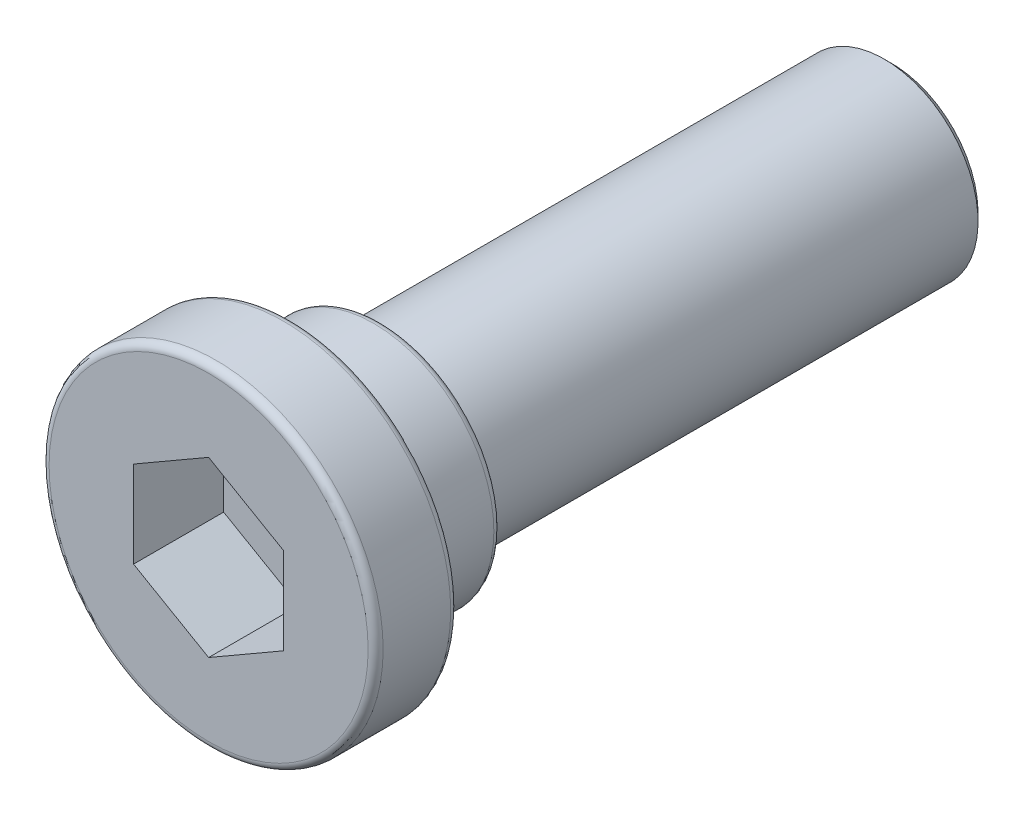
ISO-10303-21;
HEADER;
FILE_DESCRIPTION(('STEP AP214'),'2;1');
FILE_NAME('part.step','',(''),(''),'','','');
FILE_SCHEMA(('AUTOMOTIVE_DESIGN { 1 0 10303 214 1 1 1 1 }'));
ENDSEC;
DATA;
#1=APPLICATION_CONTEXT('core data for automotive mechanical design processes');
#2=APPLICATION_PROTOCOL_DEFINITION('international standard','automotive_design',2000,#1);
#3=PRODUCT_CONTEXT('',#1,'mechanical');
#4=PRODUCT('Part','Part','',(#3));
#5=PRODUCT_RELATED_PRODUCT_CATEGORY('part','',(#4));
#6=PRODUCT_DEFINITION_FORMATION('','',#4);
#7=PRODUCT_DEFINITION_CONTEXT('part definition',#1,'design');
#8=PRODUCT_DEFINITION('design','',#6,#7);
#9=PRODUCT_DEFINITION_SHAPE('','',#8);
#10=(LENGTH_UNIT() NAMED_UNIT(*) SI_UNIT(.MILLI.,.METRE.));
#11=(NAMED_UNIT(*) PLANE_ANGLE_UNIT() SI_UNIT($,.RADIAN.));
#12=(NAMED_UNIT(*) SI_UNIT($,.STERADIAN.) SOLID_ANGLE_UNIT());
#13=UNCERTAINTY_MEASURE_WITH_UNIT(LENGTH_MEASURE(1.E-05),#10,'distance_accuracy_value','');
#14=(GEOMETRIC_REPRESENTATION_CONTEXT(3) GLOBAL_UNCERTAINTY_ASSIGNED_CONTEXT((#13)) GLOBAL_UNIT_ASSIGNED_CONTEXT((#10,
#11,#12)) REPRESENTATION_CONTEXT('',''));
#15=CARTESIAN_POINT('',(0.,0.,0.));
#16=DIRECTION('',(0.,0.,1.));
#17=DIRECTION('',(1.,0.,0.));
#18=AXIS2_PLACEMENT_3D('',#15,#16,#17);
#19=CARTESIAN_POINT('',(0.,0.,7.9));
#20=DIRECTION('',(0.,0.,1.));
#21=DIRECTION('',(1.,0.,0.));
#22=AXIS2_PLACEMENT_3D('',#19,#20,#21);
#23=PLANE('',#22);
#24=DIRECTION('',(0.866025403784439,0.5,0.));
#25=VECTOR('',#24,1.);
#26=CARTESIAN_POINT('',(0.,-1.15470053837925,7.9));
#27=LINE('',#26,#25);
#28=CARTESIAN_POINT('',(0.,-1.15470053837925,7.9));
#29=VERTEX_POINT('',#28);
#30=CARTESIAN_POINT('',(1.,-0.577350269189626,7.9));
#31=VERTEX_POINT('',#30);
#32=EDGE_CURVE('E105',#29,#31,#27,.T.);
#33=ORIENTED_EDGE('',*,*,#32,.T.);
#34=DIRECTION('',(0.,1.,0.));
#35=VECTOR('',#34,1.);
#36=CARTESIAN_POINT('',(1.,-0.577350269189626,7.9));
#37=LINE('',#36,#35);
#38=CARTESIAN_POINT('',(1.,0.577350269189626,7.9));
#39=VERTEX_POINT('',#38);
#40=EDGE_CURVE('E108',#31,#39,#37,.T.);
#41=ORIENTED_EDGE('',*,*,#40,.T.);
#42=DIRECTION('',(-0.866025403784439,0.5,0.));
#43=VECTOR('',#42,1.);
#44=CARTESIAN_POINT('',(1.,0.577350269189626,7.9));
#45=LINE('',#44,#43);
#46=CARTESIAN_POINT('',(0.,1.15470053837925,7.9));
#47=VERTEX_POINT('',#46);
#48=EDGE_CURVE('E110',#39,#47,#45,.T.);
#49=ORIENTED_EDGE('',*,*,#48,.T.);
#50=DIRECTION('',(-0.866025403784439,-0.5,0.));
#51=VECTOR('',#50,1.);
#52=CARTESIAN_POINT('',(0.,1.15470053837925,7.9));
#53=LINE('',#52,#51);
#54=CARTESIAN_POINT('',(-1.,0.577350269189626,7.9));
#55=VERTEX_POINT('',#54);
#56=EDGE_CURVE('E274',#47,#55,#53,.T.);
#57=ORIENTED_EDGE('',*,*,#56,.T.);
#58=DIRECTION('',(0.,-1.,0.));
#59=VECTOR('',#58,1.);
#60=CARTESIAN_POINT('',(-1.,0.577350269189626,7.9));
#61=LINE('',#60,#59);
#62=CARTESIAN_POINT('',(-1.,-0.577350269189626,7.9));
#63=VERTEX_POINT('',#62);
#64=EDGE_CURVE('E281',#55,#63,#61,.T.);
#65=ORIENTED_EDGE('',*,*,#64,.T.);
#66=DIRECTION('',(0.866025403784439,-0.5,0.));
#67=VECTOR('',#66,1.);
#68=CARTESIAN_POINT('',(-1.,-0.577350269189626,7.9));
#69=LINE('',#68,#67);
#70=EDGE_CURVE('E287',#63,#29,#69,.T.);
#71=ORIENTED_EDGE('',*,*,#70,.T.);
#72=EDGE_LOOP('',(#33,#41,#49,#57,#65,#71));
#73=FACE_BOUND('',#72,.T.);
#74=ADVANCED_FACE('F16',(#73),#23,.T.);
#75=CARTESIAN_POINT('',(1.,0.577350269189626,7.9));
#76=DIRECTION('',(0.5,0.866025403784439,0.));
#77=DIRECTION('',(-0.866025403784439,0.5,0.));
#78=AXIS2_PLACEMENT_3D('',#75,#76,#77);
#79=PLANE('',#78);
#80=DIRECTION('',(0.,0.,1.));
#81=VECTOR('',#80,1.);
#82=CARTESIAN_POINT('',(0.,1.15470053837925,7.9));
#83=LINE('',#82,#81);
#84=CARTESIAN_POINT('',(0.,1.15470053837925,9.1));
#85=VERTEX_POINT('',#84);
#86=EDGE_CURVE('E122',#85,#47,#83,.F.);
#87=ORIENTED_EDGE('',*,*,#86,.T.);
#88=ORIENTED_EDGE('',*,*,#48,.F.);
#89=DIRECTION('',(0.,0.,1.));
#90=VECTOR('',#89,1.);
#91=CARTESIAN_POINT('',(1.,0.577350269189626,7.9));
#92=LINE('',#91,#90);
#93=CARTESIAN_POINT('',(1.,0.577350269189626,9.1));
#94=VERTEX_POINT('',#93);
#95=EDGE_CURVE('E116',#39,#94,#92,.T.);
#96=ORIENTED_EDGE('',*,*,#95,.T.);
#97=DIRECTION('',(0.866025403784438,-0.5,0.));
#98=VECTOR('',#97,1.);
#99=CARTESIAN_POINT('',(0.,1.15470053837925,9.1));
#100=LINE('',#99,#98);
#101=EDGE_CURVE('E273',#85,#94,#100,.T.);
#102=ORIENTED_EDGE('',*,*,#101,.F.);
#103=EDGE_LOOP('',(#87,#88,#96,#102));
#104=FACE_BOUND('',#103,.T.);
#105=ADVANCED_FACE('F119',(#104),#79,.F.);
#106=CARTESIAN_POINT('',(1.,-0.577350269189626,7.9));
#107=DIRECTION('',(1.,0.,0.));
#108=DIRECTION('',(0.,1.,0.));
#109=AXIS2_PLACEMENT_3D('',#106,#107,#108);
#110=PLANE('',#109);
#111=ORIENTED_EDGE('',*,*,#95,.F.);
#112=ORIENTED_EDGE('',*,*,#40,.F.);
#113=DIRECTION('',(0.,0.,1.));
#114=VECTOR('',#113,1.);
#115=CARTESIAN_POINT('',(1.,-0.577350269189626,7.9));
#116=LINE('',#115,#114);
#117=CARTESIAN_POINT('',(1.,-0.577350269189626,9.1));
#118=VERTEX_POINT('',#117);
#119=EDGE_CURVE('E136',#31,#118,#116,.T.);
#120=ORIENTED_EDGE('',*,*,#119,.T.);
#121=DIRECTION('',(0.,1.,0.));
#122=VECTOR('',#121,1.);
#123=CARTESIAN_POINT('',(1.,0.,9.1));
#124=LINE('',#123,#122);
#125=EDGE_CURVE('E128',#94,#118,#124,.F.);
#126=ORIENTED_EDGE('',*,*,#125,.F.);
#127=EDGE_LOOP('',(#111,#112,#120,#126));
#128=FACE_BOUND('',#127,.T.);
#129=ADVANCED_FACE('F126',(#128),#110,.F.);
#130=CARTESIAN_POINT('',(0.,-1.15470053837925,7.9));
#131=DIRECTION('',(0.5,-0.866025403784439,0.));
#132=DIRECTION('',(0.866025403784439,0.5,0.));
#133=AXIS2_PLACEMENT_3D('',#130,#131,#132);
#134=PLANE('',#133);
#135=ORIENTED_EDGE('',*,*,#119,.F.);
#136=ORIENTED_EDGE('',*,*,#32,.F.);
#137=DIRECTION('',(0.,0.,1.));
#138=VECTOR('',#137,1.);
#139=CARTESIAN_POINT('',(0.,-1.15470053837925,7.9));
#140=LINE('',#139,#138);
#141=CARTESIAN_POINT('',(0.,-1.15470053837925,9.1));
#142=VERTEX_POINT('',#141);
#143=EDGE_CURVE('E284',#29,#142,#140,.T.);
#144=ORIENTED_EDGE('',*,*,#143,.T.);
#145=DIRECTION('',(-0.866025403784439,-0.5,0.));
#146=VECTOR('',#145,1.);
#147=CARTESIAN_POINT('',(1.,-0.577350269189626,9.1));
#148=LINE('',#147,#146);
#149=EDGE_CURVE('E294',#118,#142,#148,.T.);
#150=ORIENTED_EDGE('',*,*,#149,.F.);
#151=EDGE_LOOP('',(#135,#136,#144,#150));
#152=FACE_BOUND('',#151,.T.);
#153=ADVANCED_FACE('F295',(#152),#134,.F.);
#154=CARTESIAN_POINT('',(-1.,-0.577350269189626,7.9));
#155=DIRECTION('',(-0.5,-0.866025403784439,0.));
#156=DIRECTION('',(0.866025403784439,-0.5,0.));
#157=AXIS2_PLACEMENT_3D('',#154,#155,#156);
#158=PLANE('',#157);
#159=ORIENTED_EDGE('',*,*,#143,.F.);
#160=ORIENTED_EDGE('',*,*,#70,.F.);
#161=DIRECTION('',(0.,0.,1.));
#162=VECTOR('',#161,1.);
#163=CARTESIAN_POINT('',(-1.,-0.577350269189626,7.9));
#164=LINE('',#163,#162);
#165=CARTESIAN_POINT('',(-1.,-0.577350269189626,9.1));
#166=VERTEX_POINT('',#165);
#167=EDGE_CURVE('E278',#63,#166,#164,.T.);
#168=ORIENTED_EDGE('',*,*,#167,.T.);
#169=DIRECTION('',(-0.866025403784439,0.5,0.));
#170=VECTOR('',#169,1.);
#171=CARTESIAN_POINT('',(0.,-1.15470053837925,9.1));
#172=LINE('',#171,#170);
#173=EDGE_CURVE('E301',#142,#166,#172,.T.);
#174=ORIENTED_EDGE('',*,*,#173,.F.);
#175=EDGE_LOOP('',(#159,#160,#168,#174));
#176=FACE_BOUND('',#175,.T.);
#177=ADVANCED_FACE('F397',(#176),#158,.F.);
#178=CARTESIAN_POINT('',(-1.,0.577350269189626,7.9));
#179=DIRECTION('',(-1.,0.,0.));
#180=DIRECTION('',(0.,-1.,0.));
#181=AXIS2_PLACEMENT_3D('',#178,#179,#180);
#182=PLANE('',#181);
#183=ORIENTED_EDGE('',*,*,#167,.F.);
#184=ORIENTED_EDGE('',*,*,#64,.F.);
#185=DIRECTION('',(0.,0.,1.));
#186=VECTOR('',#185,1.);
#187=CARTESIAN_POINT('',(-1.,0.577350269189626,7.9));
#188=LINE('',#187,#186);
#189=CARTESIAN_POINT('',(-1.,0.577350269189626,9.1));
#190=VERTEX_POINT('',#189);
#191=EDGE_CURVE('E265',#55,#190,#188,.T.);
#192=ORIENTED_EDGE('',*,*,#191,.T.);
#193=DIRECTION('',(0.,1.,0.));
#194=VECTOR('',#193,1.);
#195=CARTESIAN_POINT('',(-1.,0.,9.1));
#196=LINE('',#195,#194);
#197=EDGE_CURVE('E311',#166,#190,#196,.T.);
#198=ORIENTED_EDGE('',*,*,#197,.F.);
#199=EDGE_LOOP('',(#183,#184,#192,#198));
#200=FACE_BOUND('',#199,.T.);
#201=ADVANCED_FACE('F352',(#200),#182,.F.);
#202=CARTESIAN_POINT('',(0.,1.15470053837925,7.9));
#203=DIRECTION('',(-0.5,0.866025403784439,0.));
#204=DIRECTION('',(-0.866025403784439,-0.5,0.));
#205=AXIS2_PLACEMENT_3D('',#202,#203,#204);
#206=PLANE('',#205);
#207=ORIENTED_EDGE('',*,*,#191,.F.);
#208=ORIENTED_EDGE('',*,*,#56,.F.);
#209=ORIENTED_EDGE('',*,*,#86,.F.);
#210=DIRECTION('',(0.866025403784438,0.5,0.));
#211=VECTOR('',#210,1.);
#212=CARTESIAN_POINT('',(-1.,0.577350269189626,9.1));
#213=LINE('',#212,#211);
#214=EDGE_CURVE('E314',#190,#85,#213,.T.);
#215=ORIENTED_EDGE('',*,*,#214,.F.);
#216=EDGE_LOOP('',(#207,#208,#209,#215));
#217=FACE_BOUND('',#216,.T.);
#218=ADVANCED_FACE('F347',(#217),#206,.F.);
#219=CARTESIAN_POINT('',(0.,0.,9.1));
#220=DIRECTION('',(0.,0.,1.));
#221=DIRECTION('',(1.,0.,0.));
#222=AXIS2_PLACEMENT_3D('',#219,#220,#221);
#223=PLANE('',#222);
#224=ORIENTED_EDGE('',*,*,#197,.T.);
#225=ORIENTED_EDGE('',*,*,#214,.T.);
#226=ORIENTED_EDGE('',*,*,#101,.T.);
#227=ORIENTED_EDGE('',*,*,#125,.T.);
#228=ORIENTED_EDGE('',*,*,#149,.T.);
#229=ORIENTED_EDGE('',*,*,#173,.T.);
#230=EDGE_LOOP('',(#224,#225,#226,#227,#228,#229));
#231=FACE_BOUND('',#230,.T.);
#232=CARTESIAN_POINT('',(0.,0.,9.1));
#233=DIRECTION('',(0.,0.,-1.));
#234=DIRECTION('',(-1.,0.,0.));
#235=AXIS2_PLACEMENT_3D('',#232,#233,#234);
#236=CIRCLE('',#235,2.125);
#237=CARTESIAN_POINT('',(-2.125,0.,9.1));
#238=VERTEX_POINT('',#237);
#239=CARTESIAN_POINT('',(2.125,0.,9.1));
#240=VERTEX_POINT('',#239);
#241=EDGE_CURVE('E317',#238,#240,#236,.T.);
#242=ORIENTED_EDGE('',*,*,#241,.F.);
#243=CARTESIAN_POINT('',(0.,0.,9.1));
#244=DIRECTION('',(0.,0.,-1.));
#245=DIRECTION('',(1.,0.,0.));
#246=AXIS2_PLACEMENT_3D('',#243,#244,#245);
#247=CIRCLE('',#246,2.125);
#248=EDGE_CURVE('E244',#240,#238,#247,.T.);
#249=ORIENTED_EDGE('',*,*,#248,.F.);
#250=EDGE_LOOP('',(#242,#249));
#251=FACE_BOUND('',#250,.T.);
#252=ADVANCED_FACE('F253',(#231,#251),#223,.T.);
#253=CARTESIAN_POINT('',(0.,0.,9.));
#254=DIRECTION('',(0.,0.,1.));
#255=DIRECTION('',(1.,0.,0.));
#256=AXIS2_PLACEMENT_3D('',#253,#254,#255);
#257=TOROIDAL_SURFACE('',#256,2.125,0.1);
#258=CARTESIAN_POINT('',(0.,0.,9.));
#259=DIRECTION('',(0.,0.,-1.));
#260=DIRECTION('',(-1.,0.,0.));
#261=AXIS2_PLACEMENT_3D('',#258,#259,#260);
#262=CIRCLE('',#261,2.225);
#263=CARTESIAN_POINT('',(-2.225,0.,9.));
#264=VERTEX_POINT('',#263);
#265=EDGE_CURVE('E240',#264,#264,#262,.T.);
#266=ORIENTED_EDGE('',*,*,#265,.F.);
#267=EDGE_LOOP('',(#266));
#268=FACE_BOUND('',#267,.T.);
#269=ORIENTED_EDGE('',*,*,#248,.T.);
#270=ORIENTED_EDGE('',*,*,#241,.T.);
#271=EDGE_LOOP('',(#269,#270));
#272=FACE_BOUND('',#271,.T.);
#273=ADVANCED_FACE('F248',(#268,#272),#257,.T.);
#274=CARTESIAN_POINT('',(0.,0.,9.1));
#275=DIRECTION('',(0.,0.,-1.));
#276=DIRECTION('',(-1.,0.,0.));
#277=AXIS2_PLACEMENT_3D('',#274,#275,#276);
#278=CYLINDRICAL_SURFACE('',#277,2.225);
#279=ORIENTED_EDGE('',*,*,#265,.T.);
#280=EDGE_LOOP('',(#279));
#281=FACE_BOUND('',#280,.T.);
#282=CARTESIAN_POINT('',(0.,0.,8.1));
#283=DIRECTION('',(0.,0.,1.));
#284=DIRECTION('',(1.,0.,0.));
#285=AXIS2_PLACEMENT_3D('',#282,#283,#284);
#286=CIRCLE('',#285,2.225);
#287=CARTESIAN_POINT('',(2.225,0.,8.1));
#288=VERTEX_POINT('',#287);
#289=EDGE_CURVE('E231',#288,#288,#286,.F.);
#290=ORIENTED_EDGE('',*,*,#289,.F.);
#291=EDGE_LOOP('',(#290));
#292=FACE_BOUND('',#291,.T.);
#293=ADVANCED_FACE('F252',(#281,#292),#278,.T.);
#294=CARTESIAN_POINT('',(0.,0.,8.1));
#295=DIRECTION('',(0.,0.,1.));
#296=DIRECTION('',(1.,0.,0.));
#297=AXIS2_PLACEMENT_3D('',#294,#295,#296);
#298=TOROIDAL_SURFACE('',#297,2.125,0.1);
#299=CARTESIAN_POINT('',(0.,0.,8.));
#300=DIRECTION('',(0.,0.,1.));
#301=DIRECTION('',(1.,0.,0.));
#302=AXIS2_PLACEMENT_3D('',#299,#300,#301);
#303=CIRCLE('',#302,2.125);
#304=CARTESIAN_POINT('',(2.125,0.,8.));
#305=VERTEX_POINT('',#304);
#306=CARTESIAN_POINT('',(-2.125,0.,8.));
#307=VERTEX_POINT('',#306);
#308=EDGE_CURVE('E197',#305,#307,#303,.T.);
#309=ORIENTED_EDGE('',*,*,#308,.T.);
#310=CARTESIAN_POINT('',(0.,0.,8.));
#311=DIRECTION('',(0.,0.,1.));
#312=DIRECTION('',(-1.,0.,0.));
#313=AXIS2_PLACEMENT_3D('',#310,#311,#312);
#314=CIRCLE('',#313,2.125);
#315=EDGE_CURVE('E152',#307,#305,#314,.T.);
#316=ORIENTED_EDGE('',*,*,#315,.T.);
#317=EDGE_LOOP('',(#309,#316));
#318=FACE_BOUND('',#317,.T.);
#319=ORIENTED_EDGE('',*,*,#289,.T.);
#320=EDGE_LOOP('',(#319));
#321=FACE_BOUND('',#320,.T.);
#322=ADVANCED_FACE('F211',(#318,#321),#298,.T.);
#323=CARTESIAN_POINT('',(0.,0.,8.));
#324=DIRECTION('',(0.,0.,1.));
#325=DIRECTION('',(1.,0.,0.));
#326=AXIS2_PLACEMENT_3D('',#323,#324,#325);
#327=PLANE('',#326);
#328=CARTESIAN_POINT('',(0.,0.,8.));
#329=DIRECTION('',(0.,0.,-1.));
#330=DIRECTION('',(-1.,0.,0.));
#331=AXIS2_PLACEMENT_3D('',#328,#329,#330);
#332=CIRCLE('',#331,1.6);
#333=CARTESIAN_POINT('',(-1.6,0.,8.));
#334=VERTEX_POINT('',#333);
#335=EDGE_CURVE('E148',#334,#334,#332,.T.);
#336=ORIENTED_EDGE('',*,*,#335,.F.);
#337=EDGE_LOOP('',(#336));
#338=FACE_BOUND('',#337,.T.);
#339=ORIENTED_EDGE('',*,*,#308,.F.);
#340=ORIENTED_EDGE('',*,*,#315,.F.);
#341=EDGE_LOOP('',(#339,#340));
#342=FACE_BOUND('',#341,.T.);
#343=ADVANCED_FACE('F202',(#338,#342),#327,.F.);
#344=CARTESIAN_POINT('',(0.,0.,8.));
#345=DIRECTION('',(0.,0.,-1.));
#346=DIRECTION('',(-1.,0.,0.));
#347=AXIS2_PLACEMENT_3D('',#344,#345,#346);
#348=CYLINDRICAL_SURFACE('',#347,1.6);
#349=ORIENTED_EDGE('',*,*,#335,.T.);
#350=EDGE_LOOP('',(#349));
#351=FACE_BOUND('',#350,.T.);
#352=CARTESIAN_POINT('',(0.,0.,6.9));
#353=DIRECTION('',(0.,0.,1.));
#354=DIRECTION('',(1.,0.,0.));
#355=AXIS2_PLACEMENT_3D('',#352,#353,#354);
#356=CIRCLE('',#355,1.6);
#357=CARTESIAN_POINT('',(1.6,0.,6.9));
#358=VERTEX_POINT('',#357);
#359=EDGE_CURVE('E151',#358,#358,#356,.F.);
#360=ORIENTED_EDGE('',*,*,#359,.F.);
#361=EDGE_LOOP('',(#360));
#362=FACE_BOUND('',#361,.T.);
#363=ADVANCED_FACE('F171',(#351,#362),#348,.T.);
#364=CARTESIAN_POINT('',(0.,0.,6.9));
#365=DIRECTION('',(0.,0.,1.));
#366=DIRECTION('',(1.,0.,0.));
#367=AXIS2_PLACEMENT_3D('',#364,#365,#366);
#368=TOROIDAL_SURFACE('',#367,1.5,0.1);
#369=CARTESIAN_POINT('',(0.,0.,6.8));
#370=DIRECTION('',(0.,0.,1.));
#371=DIRECTION('',(1.,0.,0.));
#372=AXIS2_PLACEMENT_3D('',#369,#370,#371);
#373=CIRCLE('',#372,1.5);
#374=CARTESIAN_POINT('',(1.5,0.,6.8));
#375=VERTEX_POINT('',#374);
#376=CARTESIAN_POINT('',(-1.5,0.,6.8));
#377=VERTEX_POINT('',#376);
#378=EDGE_CURVE('E40',#375,#377,#373,.T.);
#379=ORIENTED_EDGE('',*,*,#378,.T.);
#380=CARTESIAN_POINT('',(0.,0.,6.8));
#381=DIRECTION('',(0.,0.,1.));
#382=DIRECTION('',(-1.,0.,0.));
#383=AXIS2_PLACEMENT_3D('',#380,#381,#382);
#384=CIRCLE('',#383,1.5);
#385=EDGE_CURVE('E147',#377,#375,#384,.T.);
#386=ORIENTED_EDGE('',*,*,#385,.T.);
#387=EDGE_LOOP('',(#379,#386));
#388=FACE_BOUND('',#387,.T.);
#389=ORIENTED_EDGE('',*,*,#359,.T.);
#390=EDGE_LOOP('',(#389));
#391=FACE_BOUND('',#390,.T.);
#392=ADVANCED_FACE('F159',(#388,#391),#368,.T.);
#393=CARTESIAN_POINT('',(0.,0.,0.));
#394=DIRECTION('',(0.,0.,1.));
#395=DIRECTION('',(1.,0.,0.));
#396=AXIS2_PLACEMENT_3D('',#393,#394,#395);
#397=PLANE('',#396);
#398=CARTESIAN_POINT('',(0.,0.,-5.6843418860808E-11));
#399=DIRECTION('',(0.,0.,1.));
#400=DIRECTION('',(0.,-1.,0.));
#401=AXIS2_PLACEMENT_3D('',#398,#399,#400);
#402=CIRCLE('',#401,1.1499999999387);
#403=CARTESIAN_POINT('',(0.,-1.1499999999387,-5.68434126266455E-11));
#404=VERTEX_POINT('',#403);
#405=EDGE_CURVE('E143',#404,#404,#402,.T.);
#406=ORIENTED_EDGE('',*,*,#405,.F.);
#407=EDGE_LOOP('',(#406));
#408=FACE_BOUND('',#407,.T.);
#409=ADVANCED_FACE('F170',(#408),#397,.F.);
#410=CARTESIAN_POINT('',(0.,0.,6.8));
#411=DIRECTION('',(0.,0.,1.));
#412=DIRECTION('',(1.,0.,0.));
#413=AXIS2_PLACEMENT_3D('',#410,#411,#412);
#414=PLANE('',#413);
#415=CARTESIAN_POINT('',(0.,0.,6.8));
#416=DIRECTION('',(0.,0.,-1.));
#417=DIRECTION('',(-1.,0.,0.));
#418=AXIS2_PLACEMENT_3D('',#415,#416,#417);
#419=CIRCLE('',#418,1.25);
#420=CARTESIAN_POINT('',(-1.25,0.,6.8));
#421=VERTEX_POINT('',#420);
#422=EDGE_CURVE('E28',#421,#421,#419,.T.);
#423=ORIENTED_EDGE('',*,*,#422,.F.);
#424=EDGE_LOOP('',(#423));
#425=FACE_BOUND('',#424,.T.);
#426=ORIENTED_EDGE('',*,*,#378,.F.);
#427=ORIENTED_EDGE('',*,*,#385,.F.);
#428=EDGE_LOOP('',(#426,#427));
#429=FACE_BOUND('',#428,.T.);
#430=ADVANCED_FACE('F362',(#425,#429),#414,.F.);
#431=CARTESIAN_POINT('',(0.,0.,0.0999999999748979));
#432=DIRECTION('',(0.,0.,1.));
#433=DIRECTION('',(0.,-1.,0.));
#434=AXIS2_PLACEMENT_3D('',#431,#432,#433);
#435=CONICAL_SURFACE('',#434,1.24999999997044,0.785398163397448);
#436=CARTESIAN_POINT('',(0.,0.,0.0999999999999977));
#437=DIRECTION('',(0.,0.,-1.));
#438=DIRECTION('',(-1.,0.,0.));
#439=AXIS2_PLACEMENT_3D('',#436,#437,#438);
#440=CIRCLE('',#439,1.25);
#441=CARTESIAN_POINT('',(-1.25,0.,0.0999999999999977));
#442=VERTEX_POINT('',#441);
#443=EDGE_CURVE('E11',#442,#442,#440,.F.);
#444=ORIENTED_EDGE('',*,*,#443,.F.);
#445=EDGE_LOOP('',(#444));
#446=FACE_BOUND('',#445,.T.);
#447=ORIENTED_EDGE('',*,*,#405,.T.);
#448=EDGE_LOOP('',(#447));
#449=FACE_BOUND('',#448,.T.);
#450=ADVANCED_FACE('F356',(#446,#449),#435,.T.);
#451=CARTESIAN_POINT('',(0.,0.,6.8));
#452=DIRECTION('',(0.,0.,-1.));
#453=DIRECTION('',(-1.,0.,0.));
#454=AXIS2_PLACEMENT_3D('',#451,#452,#453);
#455=CYLINDRICAL_SURFACE('',#454,1.25);
#456=ORIENTED_EDGE('',*,*,#443,.T.);
#457=EDGE_LOOP('',(#456));
#458=FACE_BOUND('',#457,.T.);
#459=ORIENTED_EDGE('',*,*,#422,.T.);
#460=EDGE_LOOP('',(#459));
#461=FACE_BOUND('',#460,.T.);
#462=ADVANCED_FACE('F354',(#458,#461),#455,.T.);
#463=CLOSED_SHELL('',(#74,#105,#129,#153,#177,#201,#218,#252,#273,#293,#322,#343,#363,#392,#409,
#430,#450,#462));
#464=MANIFOLD_SOLID_BREP('B1',#463);
#465=ADVANCED_BREP_SHAPE_REPRESENTATION('',(#18,#464),#14);
#466=SHAPE_DEFINITION_REPRESENTATION(#9,#465);
ENDSEC;
END-ISO-10303-21;
